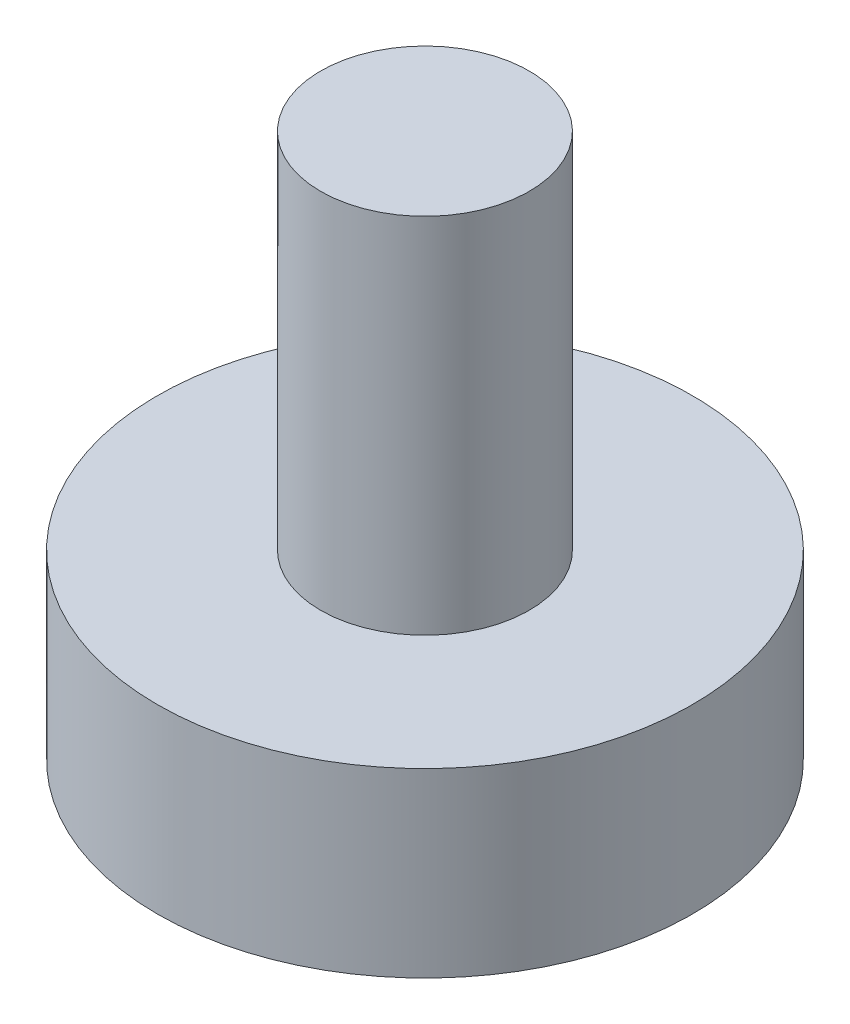
ISO-10303-21;
HEADER;
FILE_DESCRIPTION(('STEP AP214'),'2;1');
FILE_NAME('part.step','',(''),(''),'','','');
FILE_SCHEMA(('AUTOMOTIVE_DESIGN { 1 0 10303 214 1 1 1 1 }'));
ENDSEC;
DATA;
#1=APPLICATION_CONTEXT('core data for automotive mechanical design processes');
#2=APPLICATION_PROTOCOL_DEFINITION('international standard','automotive_design',2000,#1);
#3=PRODUCT_CONTEXT('',#1,'mechanical');
#4=PRODUCT('Part','Part','',(#3));
#5=PRODUCT_RELATED_PRODUCT_CATEGORY('part','',(#4));
#6=PRODUCT_DEFINITION_FORMATION('','',#4);
#7=PRODUCT_DEFINITION_CONTEXT('part definition',#1,'design');
#8=PRODUCT_DEFINITION('design','',#6,#7);
#9=PRODUCT_DEFINITION_SHAPE('','',#8);
#10=(LENGTH_UNIT() NAMED_UNIT(*) SI_UNIT(.MILLI.,.METRE.));
#11=(NAMED_UNIT(*) PLANE_ANGLE_UNIT() SI_UNIT($,.RADIAN.));
#12=(NAMED_UNIT(*) SI_UNIT($,.STERADIAN.) SOLID_ANGLE_UNIT());
#13=UNCERTAINTY_MEASURE_WITH_UNIT(LENGTH_MEASURE(1.E-05),#10,'distance_accuracy_value','');
#14=(GEOMETRIC_REPRESENTATION_CONTEXT(3) GLOBAL_UNCERTAINTY_ASSIGNED_CONTEXT((#13)) GLOBAL_UNIT_ASSIGNED_CONTEXT((#10,
#11,#12)) REPRESENTATION_CONTEXT('',''));
#15=CARTESIAN_POINT('',(0.,0.,0.));
#16=DIRECTION('',(0.,0.,1.));
#17=DIRECTION('',(1.,0.,0.));
#18=AXIS2_PLACEMENT_3D('',#15,#16,#17);
#19=CARTESIAN_POINT('',(0.,2.,0.));
#20=DIRECTION('',(0.,1.,0.));
#21=DIRECTION('',(0.,0.,1.));
#22=AXIS2_PLACEMENT_3D('',#19,#20,#21);
#23=PLANE('',#22);
#24=CARTESIAN_POINT('',(0.,2.,0.));
#25=DIRECTION('',(0.,1.,0.));
#26=DIRECTION('',(0.,0.,1.));
#27=AXIS2_PLACEMENT_3D('',#24,#25,#26);
#28=CIRCLE('',#27,2.95);
#29=CARTESIAN_POINT('',(0.,2.,2.95));
#30=VERTEX_POINT('',#29);
#31=EDGE_CURVE('E10',#30,#30,#28,.T.);
#32=ORIENTED_EDGE('',*,*,#31,.T.);
#33=EDGE_LOOP('',(#32));
#34=FACE_BOUND('',#33,.T.);
#35=CARTESIAN_POINT('',(0.,2.,0.));
#36=DIRECTION('',(0.,1.,0.));
#37=DIRECTION('',(0.,0.,1.));
#38=AXIS2_PLACEMENT_3D('',#35,#36,#37);
#39=CIRCLE('',#38,1.15);
#40=CARTESIAN_POINT('',(0.,2.,1.15));
#41=VERTEX_POINT('',#40);
#42=EDGE_CURVE('E50',#41,#41,#39,.T.);
#43=ORIENTED_EDGE('',*,*,#42,.F.);
#44=EDGE_LOOP('',(#43));
#45=FACE_BOUND('',#44,.T.);
#46=ADVANCED_FACE('F37',(#34,#45),#23,.T.);
#47=CARTESIAN_POINT('',(0.,2.,0.));
#48=DIRECTION('',(0.,-1.,0.));
#49=DIRECTION('',(0.,0.,-1.));
#50=AXIS2_PLACEMENT_3D('',#47,#48,#49);
#51=CYLINDRICAL_SURFACE('',#50,2.95);
#52=ORIENTED_EDGE('',*,*,#31,.F.);
#53=EDGE_LOOP('',(#52));
#54=FACE_BOUND('',#53,.T.);
#55=CARTESIAN_POINT('',(0.,0.,0.));
#56=DIRECTION('',(0.,1.,0.));
#57=DIRECTION('',(0.,0.,1.));
#58=AXIS2_PLACEMENT_3D('',#55,#56,#57);
#59=CIRCLE('',#58,2.95);
#60=CARTESIAN_POINT('',(0.,0.,2.95));
#61=VERTEX_POINT('',#60);
#62=EDGE_CURVE('E41',#61,#61,#59,.T.);
#63=ORIENTED_EDGE('',*,*,#62,.T.);
#64=EDGE_LOOP('',(#63));
#65=FACE_BOUND('',#64,.T.);
#66=ADVANCED_FACE('F39',(#54,#65),#51,.T.);
#67=CARTESIAN_POINT('',(0.,0.,0.));
#68=DIRECTION('',(0.,1.,0.));
#69=DIRECTION('',(0.,0.,1.));
#70=AXIS2_PLACEMENT_3D('',#67,#68,#69);
#71=PLANE('',#70);
#72=ORIENTED_EDGE('',*,*,#62,.F.);
#73=EDGE_LOOP('',(#72));
#74=FACE_BOUND('',#73,.T.);
#75=ADVANCED_FACE('F61',(#74),#71,.F.);
#76=CARTESIAN_POINT('',(0.,6.,0.));
#77=DIRECTION('',(0.,-1.,0.));
#78=DIRECTION('',(0.,0.,-1.));
#79=AXIS2_PLACEMENT_3D('',#76,#77,#78);
#80=CYLINDRICAL_SURFACE('',#79,1.15);
#81=CARTESIAN_POINT('',(0.,6.,0.));
#82=DIRECTION('',(0.,1.,0.));
#83=DIRECTION('',(0.,0.,1.));
#84=AXIS2_PLACEMENT_3D('',#81,#82,#83);
#85=CIRCLE('',#84,1.15);
#86=CARTESIAN_POINT('',(0.,6.,1.15));
#87=VERTEX_POINT('',#86);
#88=EDGE_CURVE('E48',#87,#87,#85,.T.);
#89=ORIENTED_EDGE('',*,*,#88,.F.);
#90=EDGE_LOOP('',(#89));
#91=FACE_BOUND('',#90,.T.);
#92=ORIENTED_EDGE('',*,*,#42,.T.);
#93=EDGE_LOOP('',(#92));
#94=FACE_BOUND('',#93,.T.);
#95=ADVANCED_FACE('F58',(#91,#94),#80,.T.);
#96=CARTESIAN_POINT('',(0.,6.,0.));
#97=DIRECTION('',(0.,1.,0.));
#98=DIRECTION('',(0.,0.,1.));
#99=AXIS2_PLACEMENT_3D('',#96,#97,#98);
#100=PLANE('',#99);
#101=ORIENTED_EDGE('',*,*,#88,.T.);
#102=EDGE_LOOP('',(#101));
#103=FACE_BOUND('',#102,.T.);
#104=ADVANCED_FACE('F56',(#103),#100,.T.);
#105=CLOSED_SHELL('',(#46,#66,#75,#95,#104));
#106=MANIFOLD_SOLID_BREP('B2',#105);
#107=ADVANCED_BREP_SHAPE_REPRESENTATION('',(#18,#106),#14);
#108=SHAPE_DEFINITION_REPRESENTATION(#9,#107);
ENDSEC;
END-ISO-10303-21;
